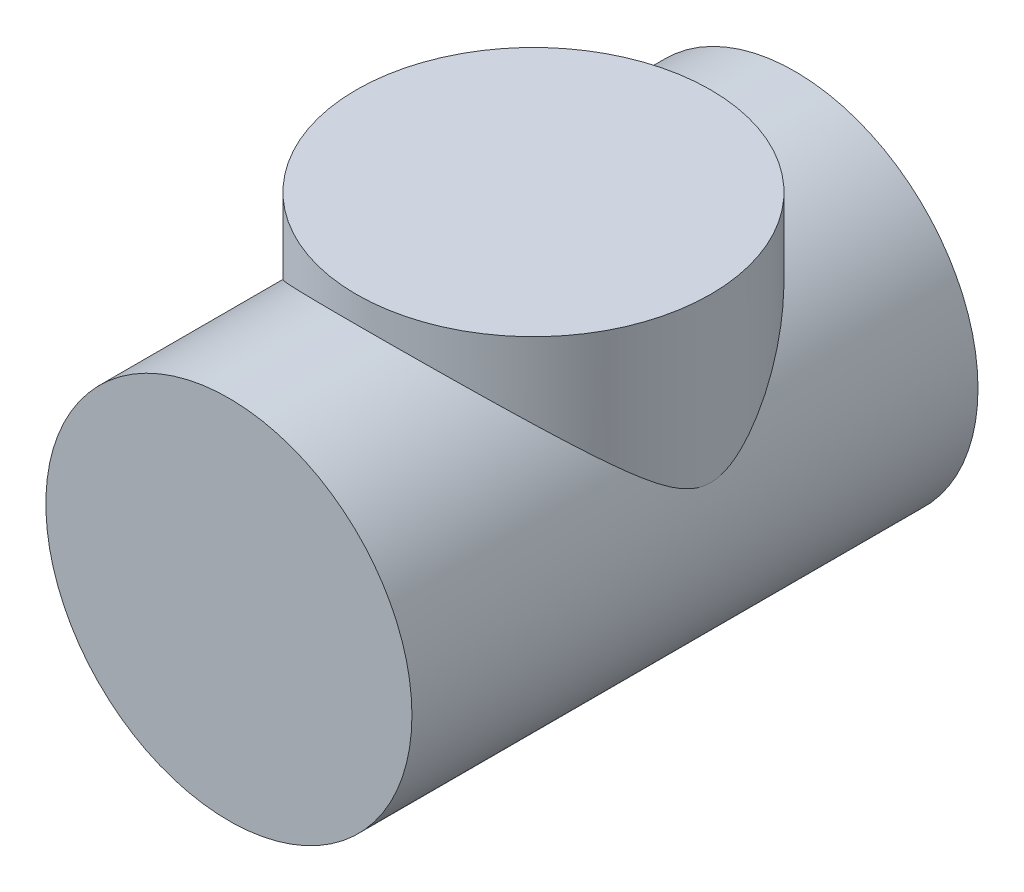
ISO-10303-21;
HEADER;
FILE_DESCRIPTION(('STEP AP214'),'2;1');
FILE_NAME('part.step','',(''),(''),'','','');
FILE_SCHEMA(('AUTOMOTIVE_DESIGN { 1 0 10303 214 1 1 1 1 }'));
ENDSEC;
DATA;
#1=APPLICATION_CONTEXT('core data for automotive mechanical design processes');
#2=APPLICATION_PROTOCOL_DEFINITION('international standard','automotive_design',2000,#1);
#3=PRODUCT_CONTEXT('',#1,'mechanical');
#4=PRODUCT('Part','Part','',(#3));
#5=PRODUCT_RELATED_PRODUCT_CATEGORY('part','',(#4));
#6=PRODUCT_DEFINITION_FORMATION('','',#4);
#7=PRODUCT_DEFINITION_CONTEXT('part definition',#1,'design');
#8=PRODUCT_DEFINITION('design','',#6,#7);
#9=PRODUCT_DEFINITION_SHAPE('','',#8);
#10=(LENGTH_UNIT() NAMED_UNIT(*) SI_UNIT(.MILLI.,.METRE.));
#11=(NAMED_UNIT(*) PLANE_ANGLE_UNIT() SI_UNIT($,.RADIAN.));
#12=(NAMED_UNIT(*) SI_UNIT($,.STERADIAN.) SOLID_ANGLE_UNIT());
#13=UNCERTAINTY_MEASURE_WITH_UNIT(LENGTH_MEASURE(1.E-05),#10,'distance_accuracy_value','');
#14=(GEOMETRIC_REPRESENTATION_CONTEXT(3) GLOBAL_UNCERTAINTY_ASSIGNED_CONTEXT((#13)) GLOBAL_UNIT_ASSIGNED_CONTEXT((#10,
#11,#12)) REPRESENTATION_CONTEXT('',''));
#15=CARTESIAN_POINT('',(0.,0.,0.));
#16=DIRECTION('',(0.,0.,1.));
#17=DIRECTION('',(1.,0.,0.));
#18=AXIS2_PLACEMENT_3D('',#15,#16,#17);
#19=CARTESIAN_POINT('',(0.,0.,0.099));
#20=DIRECTION('',(0.,0.,-1.));
#21=DIRECTION('',(-1.,0.,0.));
#22=AXIS2_PLACEMENT_3D('',#19,#20,#21);
#23=CYLINDRICAL_SURFACE('',#22,0.0595);
#24=CARTESIAN_POINT('',(0.,0.,0.099));
#25=DIRECTION('',(0.,0.,1.));
#26=DIRECTION('',(1.,0.,0.));
#27=AXIS2_PLACEMENT_3D('',#24,#25,#26);
#28=CIRCLE('',#27,0.0595);
#29=CARTESIAN_POINT('',(0.0595,0.,0.099));
#30=VERTEX_POINT('',#29);
#31=EDGE_CURVE('E42',#30,#30,#28,.T.);
#32=ORIENTED_EDGE('',*,*,#31,.F.);
#33=EDGE_LOOP('',(#32));
#34=FACE_BOUND('',#33,.T.);
#35=CARTESIAN_POINT('',(0.,0.,-0.085));
#36=DIRECTION('',(0.,0.,1.));
#37=DIRECTION('',(1.,0.,0.));
#38=AXIS2_PLACEMENT_3D('',#35,#36,#37);
#39=CIRCLE('',#38,0.0595);
#40=CARTESIAN_POINT('',(0.0595,0.,-0.085));
#41=VERTEX_POINT('',#40);
#42=EDGE_CURVE('E46',#41,#41,#39,.T.);
#43=ORIENTED_EDGE('',*,*,#42,.T.);
#44=EDGE_LOOP('',(#43));
#45=FACE_BOUND('',#44,.T.);
#46=CARTESIAN_POINT('',(0.,0.0595,-0.0575859748267089));
#47=CARTESIAN_POINT('',(-0.00259663056367629,0.059499641858402,-0.0575856144850174));
#48=CARTESIAN_POINT('',(-0.00519747484316406,0.059328276921308,-0.0574085981273397));
#49=CARTESIAN_POINT('',(-0.0103136032384686,0.0586564961884331,-0.0567140756459607));
#50=CARTESIAN_POINT('',(-0.0128286178983283,0.0581551293520188,-0.0561955854177134));
#51=CARTESIAN_POINT('',(-0.0176794768310433,0.0568677226554417,-0.0548622124708883));
#52=CARTESIAN_POINT('',(-0.0200164870864784,0.0560837713764577,-0.0540495041319761));
#53=CARTESIAN_POINT('',(-0.0244880489127355,0.0542808347015856,-0.052176313156299));
#54=CARTESIAN_POINT('',(-0.0266226328393323,0.0532618869571352,-0.051115870211541));
#55=CARTESIAN_POINT('',(-0.0315015787319799,0.0505815840530159,-0.0483178499969266));
#56=CARTESIAN_POINT('',(-0.0341381299353456,0.0488279575108105,-0.0464807393047183));
#57=CARTESIAN_POINT('',(-0.0389727765045853,0.0450645112026799,-0.0425101236945972));
#58=CARTESIAN_POINT('',(-0.0411695482979407,0.0430539470387731,-0.0403757558840932));
#59=CARTESIAN_POINT('',(-0.0458360521825465,0.0381374440272245,-0.0350941661972274));
#60=CARTESIAN_POINT('',(-0.0481308873325006,0.0351649571992692,-0.0318544123290404));
#61=CARTESIAN_POINT('',(-0.0519970111021103,0.0291421515890633,-0.0250576378229545));
#62=CARTESIAN_POINT('',(-0.0535694269155704,0.0260919619505573,-0.0215011218545288));
#63=CARTESIAN_POINT('',(-0.0556106711185053,0.0212579871927676,-0.0151872353764802));
#64=CARTESIAN_POINT('',(-0.0562728451765479,0.0193940938445683,-0.0125649950989883));
#65=CARTESIAN_POINT('',(-0.0569257776985241,0.0173219299236033,-0.00874966966194113));
#66=CARTESIAN_POINT('',(-0.0570721938306617,0.0168290048417433,-0.00774580470438515));
#67=CARTESIAN_POINT('',(-0.0573150660301086,0.015981891210548,-0.00567555081028132));
#68=CARTESIAN_POINT('',(-0.057411680235755,0.0156272644006063,-0.00460937190015976));
#69=CARTESIAN_POINT('',(-0.057529496338956,0.0151871414306029,-0.00268261974998459));
#70=CARTESIAN_POINT('',(-0.0575631505751155,0.0150577586956274,-0.00183326848169635));
#71=CARTESIAN_POINT('',(-0.0575921523845436,0.0149465146710997,-0.000124841493474044));
#72=CARTESIAN_POINT('',(-0.0575875548911135,0.0149644418293802,0.000734218512508015));
#73=CARTESIAN_POINT('',(-0.0575408634594648,0.0151428215335991,0.00243205109470031));
#74=CARTESIAN_POINT('',(-0.0574989139977787,0.0153027249121366,0.00327088906124559));
#75=CARTESIAN_POINT('',(-0.0573816454470112,0.0157368810592449,0.00491660476750369));
#76=CARTESIAN_POINT('',(-0.0573062487218149,0.0160113997794686,0.00572340336413837));
#77=CARTESIAN_POINT('',(-0.056983506344088,0.0171409434313417,0.00856214540182212));
#78=CARTESIAN_POINT('',(-0.0566539734432524,0.0182223739977344,0.0104905724444755));
#79=CARTESIAN_POINT('',(-0.0558418325594206,0.020580910453938,0.0141928539889049));
#80=CARTESIAN_POINT('',(-0.0553579024415142,0.0218596552521035,0.0159651981555758));
#81=CARTESIAN_POINT('',(-0.0535886798564201,0.0260397213641162,0.0214500046219542));
#82=CARTESIAN_POINT('',(-0.0520323378367505,0.0290721572605257,0.024979171353306));
#83=CARTESIAN_POINT('',(-0.0482234436142107,0.0350353832210612,0.0317073143342352));
#84=CARTESIAN_POINT('',(-0.0459732065646273,0.037966475775371,0.0349073420886841));
#85=CARTESIAN_POINT('',(-0.0414301654052005,0.0427970475472809,0.0401019207592363));
#86=CARTESIAN_POINT('',(-0.0393130034301925,0.0447613389231166,0.0421886240313309));
#87=CARTESIAN_POINT('',(-0.0346591951425185,0.0484540777520397,0.0460876010710611));
#88=CARTESIAN_POINT('',(-0.0321230959691499,0.050182827522443,0.0479002269511601));
#89=CARTESIAN_POINT('',(-0.0272375878977517,0.0529568364994224,0.0507981957927216));
#90=CARTESIAN_POINT('',(-0.0249693745284843,0.0540688315782265,0.0519558457571126));
#91=CARTESIAN_POINT('',(-0.0202006081920666,0.0560250950487266,0.0539887183583538));
#92=CARTESIAN_POINT('',(-0.0177001959680022,0.0568695242685478,0.0548641106598488));
#93=CARTESIAN_POINT('',(-0.0124940935774171,0.0582361022331432,0.056279414775402));
#94=CARTESIAN_POINT('',(-0.00978677963371878,0.0587553265700247,0.0568162826881624));
#95=CARTESIAN_POINT('',(-0.00427795231384679,0.0594105879730683,0.0574936527752375));
#96=CARTESIAN_POINT('',(-0.00147652770546826,0.0595469764107415,0.0576345184055123));
#97=CARTESIAN_POINT('',(0.00371399768585249,0.0594326066255871,0.0575163362524565));
#98=CARTESIAN_POINT('',(0.0061057813674245,0.0592335015197421,0.0573106453290105));
#99=CARTESIAN_POINT('',(0.0108065038553958,0.0585585805943836,0.0566128052666458));
#100=CARTESIAN_POINT('',(0.0131154338243735,0.0580827353495445,0.0561206256658506));
#101=CARTESIAN_POINT('',(0.0175975320231536,0.0568855809207784,0.0548806884402255));
#102=CARTESIAN_POINT('',(0.0197705759915939,0.0561640508453802,0.0541327008196629));
#103=CARTESIAN_POINT('',(0.0239450287922427,0.0545154228813254,0.0524202151057617));
#104=CARTESIAN_POINT('',(0.0259463793168385,0.0535882555378766,0.0514556438590888));
#105=CARTESIAN_POINT('',(0.030701011171984,0.051069272020024,0.0488279553276485));
#106=CARTESIAN_POINT('',(0.0333394145359631,0.0493749583954921,0.0470547181994106));
#107=CARTESIAN_POINT('',(0.0381907179306818,0.0457273047509654,0.0432116567898244));
#108=CARTESIAN_POINT('',(0.0404023095897093,0.0437731983251636,0.0411409534487791));
#109=CARTESIAN_POINT('',(0.0451290937518814,0.0389698400686636,0.0359958190757202));
#110=CARTESIAN_POINT('',(0.0474702572521506,0.0360502858314395,0.032827171040278));
#111=CARTESIAN_POINT('',(0.0514399249257075,0.0301144780315983,0.0261758250996817));
#112=CARTESIAN_POINT('',(0.0530694152534741,0.0270983645339931,0.0226935698831976));
#113=CARTESIAN_POINT('',(0.0552756611309366,0.0221295344320332,0.0163854968014043));
#114=CARTESIAN_POINT('',(0.0560210597390034,0.0201247726289795,0.0136674683007404));
#115=CARTESIAN_POINT('',(0.0567737808653576,0.0178164550119028,0.00969370233631631));
#116=CARTESIAN_POINT('',(0.0569467681457414,0.017250798531435,0.00862819910944281));
#117=CARTESIAN_POINT('',(0.0572370825965451,0.0162611166422243,0.0064259117459427));
#118=CARTESIAN_POINT('',(0.0573545862768498,0.0158366433790261,0.00528936686082925));
#119=CARTESIAN_POINT('',(0.0574983099208829,0.015305251639201,0.00328420244292157));
#120=CARTESIAN_POINT('',(0.0575410477841063,0.0151421641646924,0.00243227431385763));
#121=CARTESIAN_POINT('',(0.0575879504373683,0.0149628847164367,0.000712844341122496));
#122=CARTESIAN_POINT('',(0.0575921977058999,0.0149463786463578,-0.00015462020929749));
#123=CARTESIAN_POINT('',(0.0575618356155404,0.0150627635506323,-0.00187678126015805));
#124=CARTESIAN_POINT('',(0.0575272849392782,0.0151954289007799,-0.00273149506736113));
#125=CARTESIAN_POINT('',(0.0574229939554063,0.015584978747114,-0.00441073032400683));
#126=CARTESIAN_POINT('',(0.0573531595267289,0.0158421954130297,-0.0052351646584214));
#127=CARTESIAN_POINT('',(0.0570673639118754,0.016854782855845,-0.00794705505874829));
#128=CARTESIAN_POINT('',(0.0567820771348066,0.0178107889981386,-0.00974889100810981));
#129=CARTESIAN_POINT('',(0.0560785068718137,0.0199183696816296,-0.0132090405468799));
#130=CARTESIAN_POINT('',(0.0556591442102085,0.0210714945141354,-0.0148660455887275));
#131=CARTESIAN_POINT('',(0.0541380679004516,0.0248380833818159,-0.0199628354171063));
#132=CARTESIAN_POINT('',(0.0528100159565994,0.0275901619453066,-0.0232346453572805));
#133=CARTESIAN_POINT('',(0.0495803264479765,0.033049897128972,-0.029498613616797));
#134=CARTESIAN_POINT('',(0.0476801039809444,0.0357576461617274,-0.0324914382803157));
#135=CARTESIAN_POINT('',(0.0435970661830347,0.0405951833316811,-0.0377463570910697));
#136=CARTESIAN_POINT('',(0.0414999645181551,0.042750583679704,-0.0400506094300555));
#137=CARTESIAN_POINT('',(0.0368366622942058,0.0468282809062744,-0.0443765841880931));
#138=CARTESIAN_POINT('',(0.0342710598968352,0.0487508698813363,-0.0463986611342306));
#139=CARTESIAN_POINT('',(0.0293520530405033,0.0518162829476825,-0.0496083586752361));
#140=CARTESIAN_POINT('',(0.0271004160119022,0.053034783903193,-0.0508790823825482));
#141=CARTESIAN_POINT('',(0.0223411085166036,0.0552081636428571,-0.0531406930406837));
#142=CARTESIAN_POINT('',(0.0198336443964158,0.0561632526242355,-0.0541318031318677));
#143=CARTESIAN_POINT('',(0.0149935076883762,0.0576270226295064,-0.055648913917091));
#144=CARTESIAN_POINT('',(0.0126891943314214,0.0581806486723912,-0.0562218284798226));
#145=CARTESIAN_POINT('',(0.00798243044624626,0.0590101535603061,-0.0570798136609096));
#146=CARTESIAN_POINT('',(0.00558026856498242,0.0592867953526414,-0.0573656749678378));
#147=CARTESIAN_POINT('',(0.00211194100504663,0.0594719915872494,-0.0575570333182748));
#148=CARTESIAN_POINT('',(0.00105631916501989,0.0595001456933609,-0.0575861214150761));
#149=CARTESIAN_POINT('',(0.,0.0595,-0.0575859748267089));
#150=B_SPLINE_CURVE_WITH_KNOTS('',3,(#46,#47,#48,#49,#50,#51,#52,#53,#54,#55,#56,#57,#58,#59,
#60,#61,#62,#63,#64,#65,#66,#67,#68,#69,#70,#71,#72,#73,#74,#75,#76,#77,#78,#79,#80,#81,#82,#83,
#84,#85,#86,#87,#88,#89,#90,#91,#92,#93,#94,#95,#96,#97,#98,#99,#100,#101,#102,#103,#104,#105,
#106,#107,#108,#109,#110,#111,#112,#113,#114,#115,#116,#117,#118,#119,#120,#121,#122,#123,#124,
#125,#126,#127,#128,#129,#130,#131,#132,#133,#134,#135,#136,#137,#138,#139,#140,#141,#142,#143,
#144,#145,#146,#147,#148,#149),.UNSPECIFIED.,.T.,.F.,(4,2,2,2,2,2,2,2,2,2,2,2,2,2,2,2,2,2,2,2,2,
2,2,2,2,2,2,2,2,2,2,2,2,2,2,2,2,2,2,2,2,2,2,2,2,2,2,2,2,2,2,4),(0.,0.00778607430683961,
0.0155946863228505,0.0233467300705986,0.0310975326376824,0.0420193316800176,0.0529735228145452,
0.0677731660054369,0.0825496381676747,0.0923415206844677,0.0957182064152162,0.0990841029084325,
0.101651560350206,0.104215331303959,0.106769228523974,0.109329084994746,0.115981584270395,
0.122692652335735,0.137337189039468,0.151933384031483,0.162587367702606,0.173227545526256,
0.181532386297967,0.189832225695864,0.198205668500794,0.206571423539752,0.213762956627838,
0.220955254519693,0.228154036046121,0.235355252701928,0.24610167328858,0.256880530740834,
0.27151207939292,0.286123288506246,0.296441011428113,0.300090478564494,0.303728256105388,
0.306322276237429,0.308910736528306,0.311495286990978,0.314086768553745,0.320216796232246,
0.326397462110909,0.339766642324049,0.353103025609428,0.364430053514754,0.375742719404541,
0.384286429114208,0.392823301265998,0.40010723168966,0.40737104302347,0.410538447592158),.UNSPECIFIED.);
#151=CARTESIAN_POINT('',(0.,0.0595,-0.0575859748267089));
#152=VERTEX_POINT('',#151);
#153=EDGE_CURVE('E10',#152,#152,#150,.T.);
#154=ORIENTED_EDGE('',*,*,#153,.F.);
#155=EDGE_LOOP('',(#154));
#156=FACE_BOUND('',#155,.T.);
#157=ADVANCED_FACE('F31',(#34,#45,#156),#23,.T.);
#158=CARTESIAN_POINT('',(0.,0.,0.099));
#159=DIRECTION('',(0.,0.,1.));
#160=DIRECTION('',(1.,0.,0.));
#161=AXIS2_PLACEMENT_3D('',#158,#159,#160);
#162=PLANE('',#161);
#163=ORIENTED_EDGE('',*,*,#31,.T.);
#164=EDGE_LOOP('',(#163));
#165=FACE_BOUND('',#164,.T.);
#166=ADVANCED_FACE('F66',(#165),#162,.T.);
#167=CARTESIAN_POINT('',(0.,0.,-0.085));
#168=DIRECTION('',(0.,0.,1.));
#169=DIRECTION('',(1.,0.,0.));
#170=AXIS2_PLACEMENT_3D('',#167,#168,#169);
#171=PLANE('',#170);
#172=ORIENTED_EDGE('',*,*,#42,.F.);
#173=EDGE_LOOP('',(#172));
#174=FACE_BOUND('',#173,.T.);
#175=ADVANCED_FACE('F60',(#174),#171,.F.);
#176=CARTESIAN_POINT('',(0.,0.068,0.));
#177=DIRECTION('',(0.,-1.,0.));
#178=DIRECTION('',(0.,0.,-1.));
#179=AXIS2_PLACEMENT_3D('',#176,#177,#178);
#180=CYLINDRICAL_SURFACE('',#179,0.0575859748267089);
#181=CARTESIAN_POINT('',(0.,0.068,0.));
#182=DIRECTION('',(0.,1.,0.));
#183=DIRECTION('',(0.,0.,1.));
#184=AXIS2_PLACEMENT_3D('',#181,#182,#183);
#185=CIRCLE('',#184,0.0575859748267089);
#186=CARTESIAN_POINT('',(0.,0.068,0.0575859748267089));
#187=VERTEX_POINT('',#186);
#188=EDGE_CURVE('E51',#187,#187,#185,.T.);
#189=ORIENTED_EDGE('',*,*,#188,.F.);
#190=EDGE_LOOP('',(#189));
#191=FACE_BOUND('',#190,.T.);
#192=ORIENTED_EDGE('',*,*,#153,.T.);
#193=EDGE_LOOP('',(#192));
#194=FACE_BOUND('',#193,.T.);
#195=ADVANCED_FACE('F58',(#191,#194),#180,.T.);
#196=CARTESIAN_POINT('',(0.,0.068,0.));
#197=DIRECTION('',(0.,1.,0.));
#198=DIRECTION('',(0.,0.,1.));
#199=AXIS2_PLACEMENT_3D('',#196,#197,#198);
#200=PLANE('',#199);
#201=ORIENTED_EDGE('',*,*,#188,.T.);
#202=EDGE_LOOP('',(#201));
#203=FACE_BOUND('',#202,.T.);
#204=ADVANCED_FACE('F56',(#203),#200,.T.);
#205=CLOSED_SHELL('',(#157,#166,#175,#195,#204));
#206=MANIFOLD_SOLID_BREP('B2',#205);
#207=ADVANCED_BREP_SHAPE_REPRESENTATION('',(#18,#206),#14);
#208=SHAPE_DEFINITION_REPRESENTATION(#9,#207);
ENDSEC;
END-ISO-10303-21;
